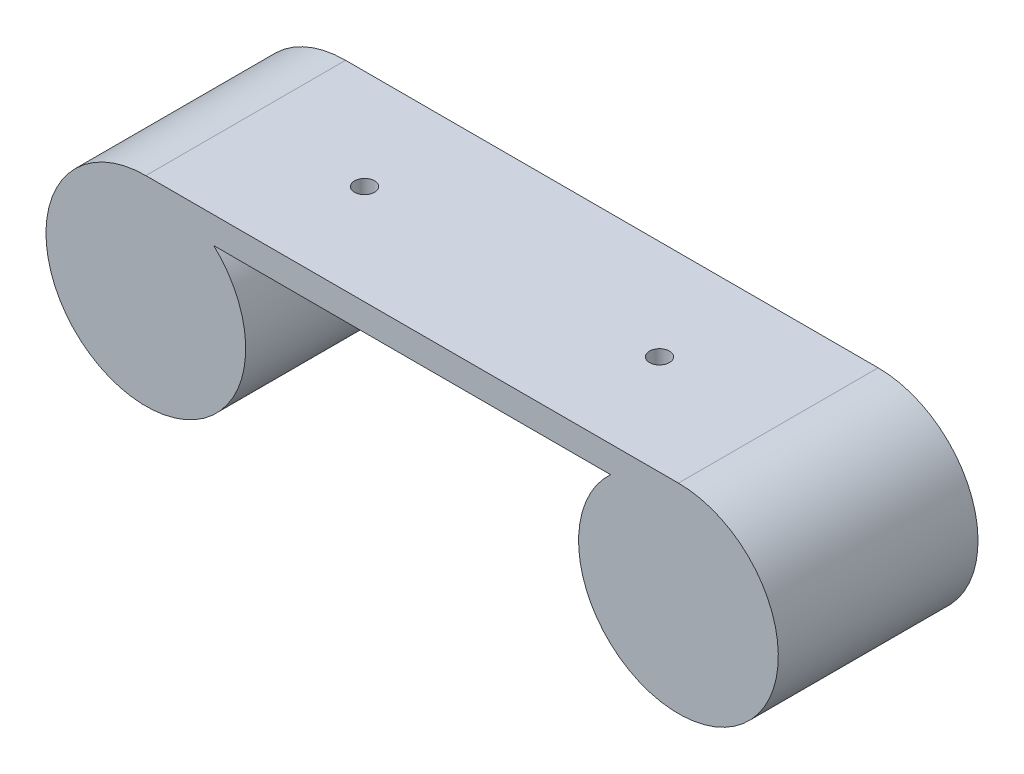
ISO-10303-21;
HEADER;
FILE_DESCRIPTION(('STEP AP214'),'2;1');
FILE_NAME('part.step','',(''),(''),'','','');
FILE_SCHEMA(('AUTOMOTIVE_DESIGN { 1 0 10303 214 1 1 1 1 }'));
ENDSEC;
DATA;
#1=APPLICATION_CONTEXT('core data for automotive mechanical design processes');
#2=APPLICATION_PROTOCOL_DEFINITION('international standard','automotive_design',2000,#1);
#3=PRODUCT_CONTEXT('',#1,'mechanical');
#4=PRODUCT('Part','Part','',(#3));
#5=PRODUCT_RELATED_PRODUCT_CATEGORY('part','',(#4));
#6=PRODUCT_DEFINITION_FORMATION('','',#4);
#7=PRODUCT_DEFINITION_CONTEXT('part definition',#1,'design');
#8=PRODUCT_DEFINITION('design','',#6,#7);
#9=PRODUCT_DEFINITION_SHAPE('','',#8);
#10=(LENGTH_UNIT() NAMED_UNIT(*) SI_UNIT(.MILLI.,.METRE.));
#11=(NAMED_UNIT(*) PLANE_ANGLE_UNIT() SI_UNIT($,.RADIAN.));
#12=(NAMED_UNIT(*) SI_UNIT($,.STERADIAN.) SOLID_ANGLE_UNIT());
#13=UNCERTAINTY_MEASURE_WITH_UNIT(LENGTH_MEASURE(1.E-05),#10,'distance_accuracy_value','');
#14=(GEOMETRIC_REPRESENTATION_CONTEXT(3) GLOBAL_UNCERTAINTY_ASSIGNED_CONTEXT((#13)) GLOBAL_UNIT_ASSIGNED_CONTEXT((#10,
#11,#12)) REPRESENTATION_CONTEXT('',''));
#15=CARTESIAN_POINT('',(0.,0.,0.));
#16=DIRECTION('',(0.,0.,1.));
#17=DIRECTION('',(1.,0.,0.));
#18=AXIS2_PLACEMENT_3D('',#15,#16,#17);
#19=CARTESIAN_POINT('',(40.,0.,30.));
#20=DIRECTION('',(0.,0.,-1.));
#21=DIRECTION('',(-1.,0.,0.));
#22=AXIS2_PLACEMENT_3D('',#19,#20,#21);
#23=CYLINDRICAL_SURFACE('',#22,9.44999999999999);
#24=CARTESIAN_POINT('',(40.,0.,0.));
#25=DIRECTION('',(0.,0.,1.));
#26=DIRECTION('',(1.,0.,0.));
#27=AXIS2_PLACEMENT_3D('',#24,#25,#26);
#28=CIRCLE('',#27,9.44999999999999);
#29=CARTESIAN_POINT('',(49.45,0.,0.));
#30=VERTEX_POINT('',#29);
#31=EDGE_CURVE('E111',#30,#30,#28,.T.);
#32=ORIENTED_EDGE('',*,*,#31,.F.);
#33=EDGE_LOOP('',(#32));
#34=FACE_BOUND('',#33,.T.);
#35=CARTESIAN_POINT('',(40.,0.,28.));
#36=DIRECTION('',(0.,0.,1.));
#37=DIRECTION('',(1.,0.,0.));
#38=AXIS2_PLACEMENT_3D('',#35,#36,#37);
#39=CIRCLE('',#38,9.44999999999999);
#40=CARTESIAN_POINT('',(49.45,0.,28.));
#41=VERTEX_POINT('',#40);
#42=EDGE_CURVE('E158',#41,#41,#39,.T.);
#43=ORIENTED_EDGE('',*,*,#42,.T.);
#44=EDGE_LOOP('',(#43));
#45=FACE_BOUND('',#44,.T.);
#46=ADVANCED_FACE('F43',(#34,#45),#23,.F.);
#47=CARTESIAN_POINT('',(-40.,0.,30.));
#48=DIRECTION('',(0.,0.,-1.));
#49=DIRECTION('',(-1.,0.,0.));
#50=AXIS2_PLACEMENT_3D('',#47,#48,#49);
#51=CYLINDRICAL_SURFACE('',#50,9.45);
#52=CARTESIAN_POINT('',(-40.,0.,0.));
#53=DIRECTION('',(0.,0.,1.));
#54=DIRECTION('',(1.,0.,0.));
#55=AXIS2_PLACEMENT_3D('',#52,#53,#54);
#56=CIRCLE('',#55,9.45);
#57=CARTESIAN_POINT('',(-30.55,0.,0.));
#58=VERTEX_POINT('',#57);
#59=EDGE_CURVE('E128',#58,#58,#56,.T.);
#60=ORIENTED_EDGE('',*,*,#59,.F.);
#61=EDGE_LOOP('',(#60));
#62=FACE_BOUND('',#61,.T.);
#63=CARTESIAN_POINT('',(-40.,0.,28.));
#64=DIRECTION('',(0.,0.,1.));
#65=DIRECTION('',(1.,0.,0.));
#66=AXIS2_PLACEMENT_3D('',#63,#64,#65);
#67=CIRCLE('',#66,9.45);
#68=CARTESIAN_POINT('',(-30.55,0.,28.));
#69=VERTEX_POINT('',#68);
#70=EDGE_CURVE('E151',#69,#69,#67,.T.);
#71=ORIENTED_EDGE('',*,*,#70,.T.);
#72=EDGE_LOOP('',(#71));
#73=FACE_BOUND('',#72,.T.);
#74=ADVANCED_FACE('F175',(#62,#73),#51,.F.);
#75=CARTESIAN_POINT('',(-40.,0.,30.));
#76=DIRECTION('',(0.,0.,-1.));
#77=DIRECTION('',(-1.,0.,0.));
#78=AXIS2_PLACEMENT_3D('',#75,#76,#77);
#79=CYLINDRICAL_SURFACE('',#78,15.);
#80=CARTESIAN_POINT('',(-40.,0.,0.));
#81=DIRECTION('',(0.,0.,1.));
#82=DIRECTION('',(1.,0.,0.));
#83=AXIS2_PLACEMENT_3D('',#80,#81,#82);
#84=CIRCLE('',#83,15.);
#85=CARTESIAN_POINT('',(-40.,15.,0.));
#86=VERTEX_POINT('',#85);
#87=CARTESIAN_POINT('',(-29.8023276035913,11.00033989,0.));
#88=VERTEX_POINT('',#87);
#89=EDGE_CURVE('E115',#86,#88,#84,.T.);
#90=ORIENTED_EDGE('',*,*,#89,.T.);
#91=DIRECTION('',(0.,0.,-1.));
#92=VECTOR('',#91,1.);
#93=CARTESIAN_POINT('',(-29.8023276035913,11.00033989,30.));
#94=LINE('',#93,#92);
#95=CARTESIAN_POINT('',(-29.8023276035913,11.00033989,30.));
#96=VERTEX_POINT('',#95);
#97=EDGE_CURVE('E11',#96,#88,#94,.T.);
#98=ORIENTED_EDGE('',*,*,#97,.F.);
#99=CARTESIAN_POINT('',(-40.,0.,30.));
#100=DIRECTION('',(0.,0.,1.));
#101=DIRECTION('',(1.,0.,0.));
#102=AXIS2_PLACEMENT_3D('',#99,#100,#101);
#103=CIRCLE('',#102,15.);
#104=CARTESIAN_POINT('',(-40.,15.,30.));
#105=VERTEX_POINT('',#104);
#106=EDGE_CURVE('E93',#105,#96,#103,.T.);
#107=ORIENTED_EDGE('',*,*,#106,.F.);
#108=DIRECTION('',(0.,0.,-1.));
#109=VECTOR('',#108,1.);
#110=CARTESIAN_POINT('',(-40.,15.,30.));
#111=LINE('',#110,#109);
#112=EDGE_CURVE('E60',#105,#86,#111,.T.);
#113=ORIENTED_EDGE('',*,*,#112,.T.);
#114=EDGE_LOOP('',(#90,#98,#107,#113));
#115=FACE_BOUND('',#114,.T.);
#116=ADVANCED_FACE('F180',(#115),#79,.T.);
#117=CARTESIAN_POINT('',(0.,11.00033989,30.));
#118=DIRECTION('',(0.,1.,0.));
#119=DIRECTION('',(-1.,0.,0.));
#120=AXIS2_PLACEMENT_3D('',#117,#118,#119);
#121=PLANE('',#120);
#122=CARTESIAN_POINT('',(-22.15,11.00033989,15.));
#123=DIRECTION('',(0.,1.,0.));
#124=DIRECTION('',(-1.,0.,0.));
#125=AXIS2_PLACEMENT_3D('',#122,#123,#124);
#126=CIRCLE('',#125,1.5);
#127=CARTESIAN_POINT('',(-23.65,11.00033989,15.));
#128=VERTEX_POINT('',#127);
#129=EDGE_CURVE('E116',#128,#128,#126,.T.);
#130=ORIENTED_EDGE('',*,*,#129,.T.);
#131=EDGE_LOOP('',(#130));
#132=FACE_BOUND('',#131,.T.);
#133=CARTESIAN_POINT('',(22.15,11.00033989,15.));
#134=DIRECTION('',(0.,1.,0.));
#135=DIRECTION('',(-1.,0.,0.));
#136=AXIS2_PLACEMENT_3D('',#133,#134,#135);
#137=CIRCLE('',#136,1.5);
#138=CARTESIAN_POINT('',(20.65,11.00033989,15.));
#139=VERTEX_POINT('',#138);
#140=EDGE_CURVE('E142',#139,#139,#137,.T.);
#141=ORIENTED_EDGE('',*,*,#140,.T.);
#142=EDGE_LOOP('',(#141));
#143=FACE_BOUND('',#142,.T.);
#144=DIRECTION('',(1.,0.,0.));
#145=VECTOR('',#144,1.);
#146=CARTESIAN_POINT('',(0.,11.00033989,0.));
#147=LINE('',#146,#145);
#148=CARTESIAN_POINT('',(29.8023276035913,11.00033989,0.));
#149=VERTEX_POINT('',#148);
#150=EDGE_CURVE('E99',#88,#149,#147,.T.);
#151=ORIENTED_EDGE('',*,*,#150,.T.);
#152=DIRECTION('',(0.,0.,-1.));
#153=VECTOR('',#152,1.);
#154=CARTESIAN_POINT('',(29.8023276035913,11.00033989,30.));
#155=LINE('',#154,#153);
#156=CARTESIAN_POINT('',(29.8023276035913,11.00033989,30.));
#157=VERTEX_POINT('',#156);
#158=EDGE_CURVE('E52',#157,#149,#155,.T.);
#159=ORIENTED_EDGE('',*,*,#158,.F.);
#160=DIRECTION('',(1.,0.,0.));
#161=VECTOR('',#160,1.);
#162=CARTESIAN_POINT('',(0.,11.00033989,30.));
#163=LINE('',#162,#161);
#164=EDGE_CURVE('E86',#96,#157,#163,.T.);
#165=ORIENTED_EDGE('',*,*,#164,.F.);
#166=ORIENTED_EDGE('',*,*,#97,.T.);
#167=EDGE_LOOP('',(#151,#159,#165,#166));
#168=FACE_BOUND('',#167,.T.);
#169=ADVANCED_FACE('F98',(#132,#143,#168),#121,.F.);
#170=CARTESIAN_POINT('',(40.,0.,30.));
#171=DIRECTION('',(0.,0.,-1.));
#172=DIRECTION('',(-1.,0.,0.));
#173=AXIS2_PLACEMENT_3D('',#170,#171,#172);
#174=CYLINDRICAL_SURFACE('',#173,15.);
#175=CARTESIAN_POINT('',(40.,0.,0.));
#176=DIRECTION('',(0.,0.,1.));
#177=DIRECTION('',(1.,0.,0.));
#178=AXIS2_PLACEMENT_3D('',#175,#176,#177);
#179=CIRCLE('',#178,15.);
#180=CARTESIAN_POINT('',(40.,15.,0.));
#181=VERTEX_POINT('',#180);
#182=EDGE_CURVE('E121',#149,#181,#179,.T.);
#183=ORIENTED_EDGE('',*,*,#182,.T.);
#184=DIRECTION('',(0.,0.,-1.));
#185=VECTOR('',#184,1.);
#186=CARTESIAN_POINT('',(40.,15.,30.));
#187=LINE('',#186,#185);
#188=CARTESIAN_POINT('',(40.,15.,30.));
#189=VERTEX_POINT('',#188);
#190=EDGE_CURVE('E75',#189,#181,#187,.T.);
#191=ORIENTED_EDGE('',*,*,#190,.F.);
#192=CARTESIAN_POINT('',(40.,0.,30.));
#193=DIRECTION('',(0.,0.,1.));
#194=DIRECTION('',(1.,0.,0.));
#195=AXIS2_PLACEMENT_3D('',#192,#193,#194);
#196=CIRCLE('',#195,15.);
#197=EDGE_CURVE('E92',#157,#189,#196,.T.);
#198=ORIENTED_EDGE('',*,*,#197,.F.);
#199=ORIENTED_EDGE('',*,*,#158,.T.);
#200=EDGE_LOOP('',(#183,#191,#198,#199));
#201=FACE_BOUND('',#200,.T.);
#202=ADVANCED_FACE('F103',(#201),#174,.T.);
#203=CARTESIAN_POINT('',(0.,15.,30.));
#204=DIRECTION('',(0.,1.,0.));
#205=DIRECTION('',(-1.,0.,0.));
#206=AXIS2_PLACEMENT_3D('',#203,#204,#205);
#207=PLANE('',#206);
#208=CARTESIAN_POINT('',(-22.15,15.,15.));
#209=DIRECTION('',(0.,1.,0.));
#210=DIRECTION('',(0.,0.,1.));
#211=AXIS2_PLACEMENT_3D('',#208,#209,#210);
#212=CIRCLE('',#211,1.5);
#213=CARTESIAN_POINT('',(-22.15,15.,16.5));
#214=VERTEX_POINT('',#213);
#215=EDGE_CURVE('E146',#214,#214,#212,.T.);
#216=ORIENTED_EDGE('',*,*,#215,.F.);
#217=EDGE_LOOP('',(#216));
#218=FACE_BOUND('',#217,.T.);
#219=CARTESIAN_POINT('',(22.15,15.,15.));
#220=DIRECTION('',(0.,1.,0.));
#221=DIRECTION('',(0.,0.,1.));
#222=AXIS2_PLACEMENT_3D('',#219,#220,#221);
#223=CIRCLE('',#222,1.5);
#224=CARTESIAN_POINT('',(22.15,15.,16.5));
#225=VERTEX_POINT('',#224);
#226=EDGE_CURVE('E147',#225,#225,#223,.T.);
#227=ORIENTED_EDGE('',*,*,#226,.F.);
#228=EDGE_LOOP('',(#227));
#229=FACE_BOUND('',#228,.T.);
#230=DIRECTION('',(1.,0.,0.));
#231=VECTOR('',#230,1.);
#232=CARTESIAN_POINT('',(0.,15.,0.));
#233=LINE('',#232,#231);
#234=EDGE_CURVE('E124',#86,#181,#233,.T.);
#235=ORIENTED_EDGE('',*,*,#234,.F.);
#236=ORIENTED_EDGE('',*,*,#112,.F.);
#237=DIRECTION('',(1.,0.,0.));
#238=VECTOR('',#237,1.);
#239=CARTESIAN_POINT('',(0.,15.,30.));
#240=LINE('',#239,#238);
#241=EDGE_CURVE('E105',#105,#189,#240,.T.);
#242=ORIENTED_EDGE('',*,*,#241,.T.);
#243=ORIENTED_EDGE('',*,*,#190,.T.);
#244=EDGE_LOOP('',(#235,#236,#242,#243));
#245=FACE_BOUND('',#244,.T.);
#246=ADVANCED_FACE('F190',(#218,#229,#245),#207,.T.);
#247=CARTESIAN_POINT('',(0.,0.,30.));
#248=DIRECTION('',(0.,0.,1.));
#249=DIRECTION('',(1.,0.,0.));
#250=AXIS2_PLACEMENT_3D('',#247,#248,#249);
#251=PLANE('',#250);
#252=ORIENTED_EDGE('',*,*,#106,.T.);
#253=ORIENTED_EDGE('',*,*,#164,.T.);
#254=ORIENTED_EDGE('',*,*,#197,.T.);
#255=ORIENTED_EDGE('',*,*,#241,.F.);
#256=EDGE_LOOP('',(#252,#253,#254,#255));
#257=FACE_BOUND('',#256,.T.);
#258=ADVANCED_FACE('F89',(#257),#251,.T.);
#259=CARTESIAN_POINT('',(0.,0.,0.));
#260=DIRECTION('',(0.,0.,1.));
#261=DIRECTION('',(1.,0.,0.));
#262=AXIS2_PLACEMENT_3D('',#259,#260,#261);
#263=PLANE('',#262);
#264=ORIENTED_EDGE('',*,*,#31,.T.);
#265=EDGE_LOOP('',(#264));
#266=FACE_BOUND('',#265,.T.);
#267=ORIENTED_EDGE('',*,*,#89,.F.);
#268=ORIENTED_EDGE('',*,*,#234,.T.);
#269=ORIENTED_EDGE('',*,*,#182,.F.);
#270=ORIENTED_EDGE('',*,*,#150,.F.);
#271=EDGE_LOOP('',(#267,#268,#269,#270));
#272=FACE_BOUND('',#271,.T.);
#273=ORIENTED_EDGE('',*,*,#59,.T.);
#274=EDGE_LOOP('',(#273));
#275=FACE_BOUND('',#274,.T.);
#276=ADVANCED_FACE('F185',(#266,#272,#275),#263,.F.);
#277=CARTESIAN_POINT('',(22.15,9.00000000000002,15.));
#278=DIRECTION('',(0.,1.,0.));
#279=DIRECTION('',(0.,0.,1.));
#280=AXIS2_PLACEMENT_3D('',#277,#278,#279);
#281=CYLINDRICAL_SURFACE('',#280,1.5);
#282=ORIENTED_EDGE('',*,*,#226,.T.);
#283=EDGE_LOOP('',(#282));
#284=FACE_BOUND('',#283,.T.);
#285=ORIENTED_EDGE('',*,*,#140,.F.);
#286=EDGE_LOOP('',(#285));
#287=FACE_BOUND('',#286,.T.);
#288=ADVANCED_FACE('F188',(#284,#287),#281,.F.);
#289=CARTESIAN_POINT('',(-22.15,9.00000000000002,15.));
#290=DIRECTION('',(0.,1.,0.));
#291=DIRECTION('',(0.,0.,1.));
#292=AXIS2_PLACEMENT_3D('',#289,#290,#291);
#293=CYLINDRICAL_SURFACE('',#292,1.5);
#294=ORIENTED_EDGE('',*,*,#215,.T.);
#295=EDGE_LOOP('',(#294));
#296=FACE_BOUND('',#295,.T.);
#297=ORIENTED_EDGE('',*,*,#129,.F.);
#298=EDGE_LOOP('',(#297));
#299=FACE_BOUND('',#298,.T.);
#300=ADVANCED_FACE('F171',(#296,#299),#293,.F.);
#301=CARTESIAN_POINT('',(-40.,0.,28.));
#302=DIRECTION('',(0.,0.,1.));
#303=DIRECTION('',(1.,0.,0.));
#304=AXIS2_PLACEMENT_3D('',#301,#302,#303);
#305=PLANE('',#304);
#306=ORIENTED_EDGE('',*,*,#70,.F.);
#307=EDGE_LOOP('',(#306));
#308=FACE_BOUND('',#307,.T.);
#309=ADVANCED_FACE('F166',(#308),#305,.F.);
#310=CARTESIAN_POINT('',(40.,0.,28.));
#311=DIRECTION('',(0.,0.,1.));
#312=DIRECTION('',(1.,0.,0.));
#313=AXIS2_PLACEMENT_3D('',#310,#311,#312);
#314=PLANE('',#313);
#315=ORIENTED_EDGE('',*,*,#42,.F.);
#316=EDGE_LOOP('',(#315));
#317=FACE_BOUND('',#316,.T.);
#318=ADVANCED_FACE('F164',(#317),#314,.F.);
#319=CLOSED_SHELL('',(#46,#74,#116,#169,#202,#246,#258,#276,#288,#300,#309,#318));
#320=MANIFOLD_SOLID_BREP('B2',#319);
#321=ADVANCED_BREP_SHAPE_REPRESENTATION('',(#18,#320),#14);
#322=SHAPE_DEFINITION_REPRESENTATION(#9,#321);
ENDSEC;
END-ISO-10303-21;
